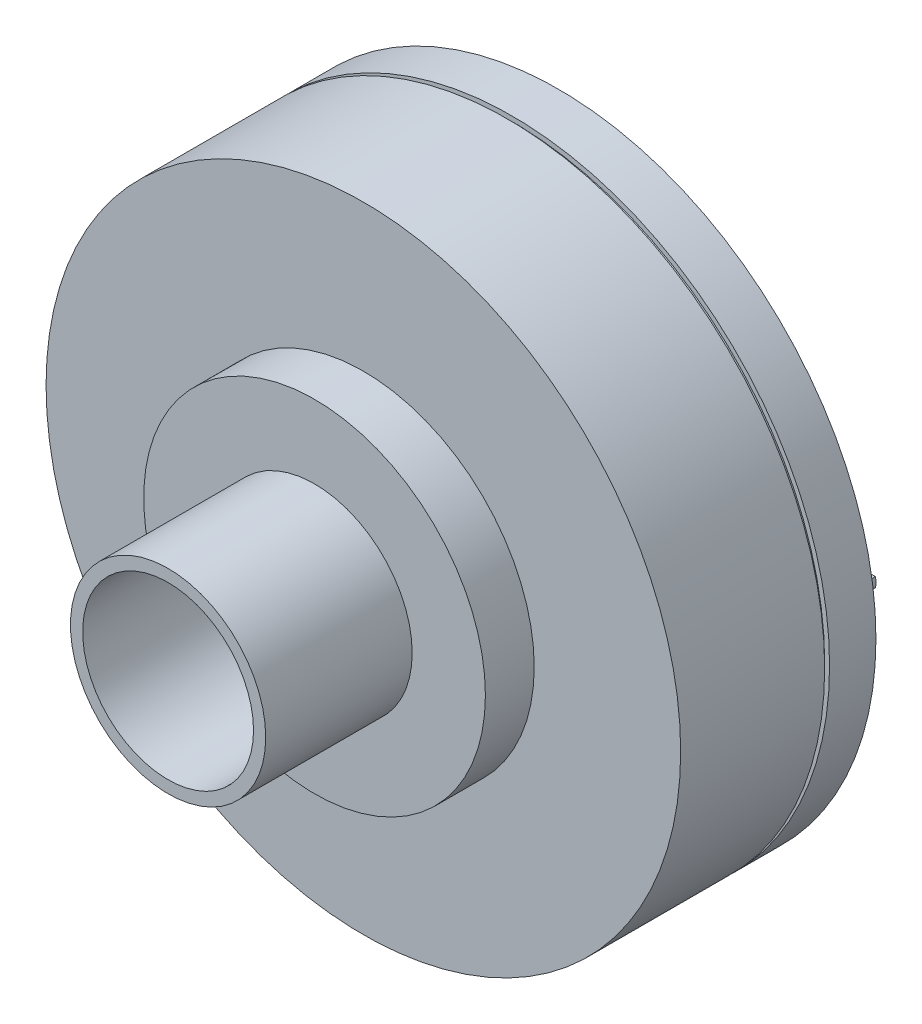
ISO-10303-21;
HEADER;
FILE_DESCRIPTION(('STEP AP214'),'2;1');
FILE_NAME('part.step','',(''),(''),'','','');
FILE_SCHEMA(('AUTOMOTIVE_DESIGN { 1 0 10303 214 1 1 1 1 }'));
ENDSEC;
DATA;
#1=APPLICATION_CONTEXT('core data for automotive mechanical design processes');
#2=APPLICATION_PROTOCOL_DEFINITION('international standard','automotive_design',2000,#1);
#3=PRODUCT_CONTEXT('',#1,'mechanical');
#4=PRODUCT('Part','Part','',(#3));
#5=PRODUCT_RELATED_PRODUCT_CATEGORY('part','',(#4));
#6=PRODUCT_DEFINITION_FORMATION('','',#4);
#7=PRODUCT_DEFINITION_CONTEXT('part definition',#1,'design');
#8=PRODUCT_DEFINITION('design','',#6,#7);
#9=PRODUCT_DEFINITION_SHAPE('','',#8);
#10=(LENGTH_UNIT() NAMED_UNIT(*) SI_UNIT(.MILLI.,.METRE.));
#11=(NAMED_UNIT(*) PLANE_ANGLE_UNIT() SI_UNIT($,.RADIAN.));
#12=(NAMED_UNIT(*) SI_UNIT($,.STERADIAN.) SOLID_ANGLE_UNIT());
#13=UNCERTAINTY_MEASURE_WITH_UNIT(LENGTH_MEASURE(1.E-05),#10,'distance_accuracy_value','');
#14=(GEOMETRIC_REPRESENTATION_CONTEXT(3) GLOBAL_UNCERTAINTY_ASSIGNED_CONTEXT((#13)) GLOBAL_UNIT_ASSIGNED_CONTEXT((#10,
#11,#12)) REPRESENTATION_CONTEXT('',''));
#15=CARTESIAN_POINT('',(0.,0.,0.));
#16=DIRECTION('',(0.,0.,1.));
#17=DIRECTION('',(1.,0.,0.));
#18=AXIS2_PLACEMENT_3D('',#15,#16,#17);
#19=CARTESIAN_POINT('',(2.,-3.,1.));
#20=DIRECTION('',(0.,0.,-1.));
#21=DIRECTION('',(-1.,0.,0.));
#22=AXIS2_PLACEMENT_3D('',#19,#20,#21);
#23=CYLINDRICAL_SURFACE('',#22,0.5);
#24=DIRECTION('',(0.,0.,1.));
#25=VECTOR('',#24,1.);
#26=CARTESIAN_POINT('',(1.51010205144336,-2.9,-4.));
#27=LINE('',#26,#25);
#28=CARTESIAN_POINT('',(1.51010205144336,-2.9,0.));
#29=VERTEX_POINT('',#28);
#30=CARTESIAN_POINT('',(1.51010205144336,-2.9,1.));
#31=VERTEX_POINT('',#30);
#32=EDGE_CURVE('E185',#29,#31,#27,.T.);
#33=ORIENTED_EDGE('',*,*,#32,.F.);
#34=CARTESIAN_POINT('',(2.,-3.,0.));
#35=DIRECTION('',(0.,0.,-1.));
#36=DIRECTION('',(-1.,0.,0.));
#37=AXIS2_PLACEMENT_3D('',#34,#35,#36);
#38=CIRCLE('',#37,0.5);
#39=CARTESIAN_POINT('',(2.48989794855664,-2.9,0.));
#40=VERTEX_POINT('',#39);
#41=EDGE_CURVE('E278',#29,#40,#38,.T.);
#42=ORIENTED_EDGE('',*,*,#41,.T.);
#43=DIRECTION('',(0.,0.,1.));
#44=VECTOR('',#43,1.);
#45=CARTESIAN_POINT('',(2.48989794855664,-2.9,-4.));
#46=LINE('',#45,#44);
#47=CARTESIAN_POINT('',(2.48989794855664,-2.9,1.));
#48=VERTEX_POINT('',#47);
#49=EDGE_CURVE('E747',#40,#48,#46,.T.);
#50=ORIENTED_EDGE('',*,*,#49,.T.);
#51=CARTESIAN_POINT('',(2.,-3.,1.));
#52=DIRECTION('',(0.,0.,-1.));
#53=DIRECTION('',(-1.,0.,0.));
#54=AXIS2_PLACEMENT_3D('',#51,#52,#53);
#55=CIRCLE('',#54,0.5);
#56=EDGE_CURVE('E273',#31,#48,#55,.T.);
#57=ORIENTED_EDGE('',*,*,#56,.F.);
#58=EDGE_LOOP('',(#33,#42,#50,#57));
#59=FACE_BOUND('',#58,.T.);
#60=ADVANCED_FACE('F32',(#59),#23,.F.);
#61=DIRECTION('',(0.,0.,1.));
#62=VECTOR('',#61,1.);
#63=CARTESIAN_POINT('',(2.48989794855664,-3.1,-4.));
#64=LINE('',#63,#62);
#65=CARTESIAN_POINT('',(2.48989794855664,-3.1,0.));
#66=VERTEX_POINT('',#65);
#67=CARTESIAN_POINT('',(2.48989794855664,-3.1,1.));
#68=VERTEX_POINT('',#67);
#69=EDGE_CURVE('E47',#66,#68,#64,.T.);
#70=ORIENTED_EDGE('',*,*,#69,.F.);
#71=CARTESIAN_POINT('',(1.51010205144336,-3.1,0.));
#72=VERTEX_POINT('',#71);
#73=EDGE_CURVE('E268',#66,#72,#38,.T.);
#74=ORIENTED_EDGE('',*,*,#73,.T.);
#75=DIRECTION('',(0.,0.,1.));
#76=VECTOR('',#75,1.);
#77=CARTESIAN_POINT('',(1.51010205144336,-3.1,-4.));
#78=LINE('',#77,#76);
#79=CARTESIAN_POINT('',(1.51010205144336,-3.1,1.));
#80=VERTEX_POINT('',#79);
#81=EDGE_CURVE('E756',#72,#80,#78,.T.);
#82=ORIENTED_EDGE('',*,*,#81,.T.);
#83=EDGE_CURVE('E277',#68,#80,#55,.T.);
#84=ORIENTED_EDGE('',*,*,#83,.F.);
#85=EDGE_LOOP('',(#70,#74,#82,#84));
#86=FACE_BOUND('',#85,.T.);
#87=ADVANCED_FACE('F331',(#86),#23,.F.);
#88=CARTESIAN_POINT('',(2.,-3.,1.));
#89=DIRECTION('',(0.,0.,-1.));
#90=DIRECTION('',(-1.,0.,0.));
#91=AXIS2_PLACEMENT_3D('',#88,#89,#90);
#92=PLANE('',#91);
#93=ORIENTED_EDGE('',*,*,#56,.T.);
#94=DIRECTION('',(1.,0.,0.));
#95=VECTOR('',#94,1.);
#96=CARTESIAN_POINT('',(2.48989794855664,-2.9,1.));
#97=LINE('',#96,#95);
#98=EDGE_CURVE('E749',#31,#48,#97,.T.);
#99=ORIENTED_EDGE('',*,*,#98,.F.);
#100=EDGE_LOOP('',(#93,#99));
#101=FACE_BOUND('',#100,.T.);
#102=ADVANCED_FACE('F337',(#101),#92,.T.);
#103=ORIENTED_EDGE('',*,*,#83,.T.);
#104=DIRECTION('',(-1.,0.,0.));
#105=VECTOR('',#104,1.);
#106=CARTESIAN_POINT('',(2.48989794855664,-3.1,1.));
#107=LINE('',#106,#105);
#108=EDGE_CURVE('E179',#68,#80,#107,.T.);
#109=ORIENTED_EDGE('',*,*,#108,.F.);
#110=EDGE_LOOP('',(#103,#109));
#111=FACE_BOUND('',#110,.T.);
#112=ADVANCED_FACE('F589',(#111),#92,.T.);
#113=CARTESIAN_POINT('',(-2.,-3.,1.));
#114=DIRECTION('',(0.,0.,-1.));
#115=DIRECTION('',(-1.,0.,0.));
#116=AXIS2_PLACEMENT_3D('',#113,#114,#115);
#117=CYLINDRICAL_SURFACE('',#116,0.5);
#118=DIRECTION('',(0.,0.,1.));
#119=VECTOR('',#118,1.);
#120=CARTESIAN_POINT('',(-2.48989794855664,-2.9,-4.));
#121=LINE('',#120,#119);
#122=CARTESIAN_POINT('',(-2.48989794855664,-2.9,0.));
#123=VERTEX_POINT('',#122);
#124=CARTESIAN_POINT('',(-2.48989794855664,-2.9,1.));
#125=VERTEX_POINT('',#124);
#126=EDGE_CURVE('E215',#123,#125,#121,.T.);
#127=ORIENTED_EDGE('',*,*,#126,.F.);
#128=CARTESIAN_POINT('',(-2.,-3.,0.));
#129=DIRECTION('',(0.,0.,-1.));
#130=DIRECTION('',(-1.,0.,0.));
#131=AXIS2_PLACEMENT_3D('',#128,#129,#130);
#132=CIRCLE('',#131,0.5);
#133=CARTESIAN_POINT('',(-1.51010205144336,-2.9,0.));
#134=VERTEX_POINT('',#133);
#135=EDGE_CURVE('E270',#123,#134,#132,.T.);
#136=ORIENTED_EDGE('',*,*,#135,.T.);
#137=DIRECTION('',(0.,0.,1.));
#138=VECTOR('',#137,1.);
#139=CARTESIAN_POINT('',(-1.51010205144336,-2.9,-4.));
#140=LINE('',#139,#138);
#141=CARTESIAN_POINT('',(-1.51010205144336,-2.9,1.));
#142=VERTEX_POINT('',#141);
#143=EDGE_CURVE('E211',#134,#142,#140,.T.);
#144=ORIENTED_EDGE('',*,*,#143,.T.);
#145=CARTESIAN_POINT('',(-2.,-3.,1.));
#146=DIRECTION('',(0.,0.,-1.));
#147=DIRECTION('',(-1.,0.,0.));
#148=AXIS2_PLACEMENT_3D('',#145,#146,#147);
#149=CIRCLE('',#148,0.5);
#150=EDGE_CURVE('E265',#125,#142,#149,.T.);
#151=ORIENTED_EDGE('',*,*,#150,.F.);
#152=EDGE_LOOP('',(#127,#136,#144,#151));
#153=FACE_BOUND('',#152,.T.);
#154=ADVANCED_FACE('F597',(#153),#117,.F.);
#155=DIRECTION('',(0.,0.,1.));
#156=VECTOR('',#155,1.);
#157=CARTESIAN_POINT('',(-1.51010205144336,-3.1,-4.));
#158=LINE('',#157,#156);
#159=CARTESIAN_POINT('',(-1.51010205144336,-3.1,0.));
#160=VERTEX_POINT('',#159);
#161=CARTESIAN_POINT('',(-1.51010205144336,-3.1,1.));
#162=VERTEX_POINT('',#161);
#163=EDGE_CURVE('E55',#160,#162,#158,.T.);
#164=ORIENTED_EDGE('',*,*,#163,.F.);
#165=CARTESIAN_POINT('',(-2.48989794855664,-3.1,0.));
#166=VERTEX_POINT('',#165);
#167=EDGE_CURVE('E260',#160,#166,#132,.T.);
#168=ORIENTED_EDGE('',*,*,#167,.T.);
#169=DIRECTION('',(0.,0.,1.));
#170=VECTOR('',#169,1.);
#171=CARTESIAN_POINT('',(-2.48989794855664,-3.1,-4.));
#172=LINE('',#171,#170);
#173=CARTESIAN_POINT('',(-2.48989794855664,-3.1,1.));
#174=VERTEX_POINT('',#173);
#175=EDGE_CURVE('E203',#166,#174,#172,.T.);
#176=ORIENTED_EDGE('',*,*,#175,.T.);
#177=EDGE_CURVE('E269',#162,#174,#149,.T.);
#178=ORIENTED_EDGE('',*,*,#177,.F.);
#179=EDGE_LOOP('',(#164,#168,#176,#178));
#180=FACE_BOUND('',#179,.T.);
#181=ADVANCED_FACE('F605',(#180),#117,.F.);
#182=CARTESIAN_POINT('',(-2.,-3.,1.));
#183=DIRECTION('',(0.,0.,-1.));
#184=DIRECTION('',(-1.,0.,0.));
#185=AXIS2_PLACEMENT_3D('',#182,#183,#184);
#186=PLANE('',#185);
#187=ORIENTED_EDGE('',*,*,#150,.T.);
#188=DIRECTION('',(1.,0.,0.));
#189=VECTOR('',#188,1.);
#190=CARTESIAN_POINT('',(-1.51010205144336,-2.9,1.));
#191=LINE('',#190,#189);
#192=EDGE_CURVE('E192',#125,#142,#191,.T.);
#193=ORIENTED_EDGE('',*,*,#192,.F.);
#194=EDGE_LOOP('',(#187,#193));
#195=FACE_BOUND('',#194,.T.);
#196=ADVANCED_FACE('F613',(#195),#186,.T.);
#197=ORIENTED_EDGE('',*,*,#177,.T.);
#198=DIRECTION('',(-1.,0.,0.));
#199=VECTOR('',#198,1.);
#200=CARTESIAN_POINT('',(-1.51010205144336,-3.1,1.));
#201=LINE('',#200,#199);
#202=EDGE_CURVE('E197',#162,#174,#201,.T.);
#203=ORIENTED_EDGE('',*,*,#202,.F.);
#204=EDGE_LOOP('',(#197,#203));
#205=FACE_BOUND('',#204,.T.);
#206=ADVANCED_FACE('F621',(#205),#186,.T.);
#207=CARTESIAN_POINT('',(0.,-2.,1.));
#208=DIRECTION('',(0.,0.,-1.));
#209=DIRECTION('',(-1.,0.,0.));
#210=AXIS2_PLACEMENT_3D('',#207,#208,#209);
#211=CYLINDRICAL_SURFACE('',#210,0.5);
#212=DIRECTION('',(0.,0.,1.));
#213=VECTOR('',#212,1.);
#214=CARTESIAN_POINT('',(-0.489897948556636,-1.9,-4.));
#215=LINE('',#214,#213);
#216=CARTESIAN_POINT('',(-0.489897948556636,-1.9,0.));
#217=VERTEX_POINT('',#216);
#218=CARTESIAN_POINT('',(-0.489897948556636,-1.9,1.));
#219=VERTEX_POINT('',#218);
#220=EDGE_CURVE('E248',#217,#219,#215,.T.);
#221=ORIENTED_EDGE('',*,*,#220,.F.);
#222=CARTESIAN_POINT('',(0.,-2.,0.));
#223=DIRECTION('',(0.,0.,-1.));
#224=DIRECTION('',(-1.,0.,0.));
#225=AXIS2_PLACEMENT_3D('',#222,#223,#224);
#226=CIRCLE('',#225,0.5);
#227=CARTESIAN_POINT('',(0.489897948556636,-1.9,0.));
#228=VERTEX_POINT('',#227);
#229=EDGE_CURVE('E262',#217,#228,#226,.T.);
#230=ORIENTED_EDGE('',*,*,#229,.T.);
#231=DIRECTION('',(0.,0.,1.));
#232=VECTOR('',#231,1.);
#233=CARTESIAN_POINT('',(0.489897948556636,-1.9,-4.));
#234=LINE('',#233,#232);
#235=CARTESIAN_POINT('',(0.489897948556636,-1.9,1.));
#236=VERTEX_POINT('',#235);
#237=EDGE_CURVE('E244',#228,#236,#234,.T.);
#238=ORIENTED_EDGE('',*,*,#237,.T.);
#239=CARTESIAN_POINT('',(0.,-2.,1.));
#240=DIRECTION('',(0.,0.,-1.));
#241=DIRECTION('',(-1.,0.,0.));
#242=AXIS2_PLACEMENT_3D('',#239,#240,#241);
#243=CIRCLE('',#242,0.5);
#244=EDGE_CURVE('E257',#219,#236,#243,.T.);
#245=ORIENTED_EDGE('',*,*,#244,.F.);
#246=EDGE_LOOP('',(#221,#230,#238,#245));
#247=FACE_BOUND('',#246,.T.);
#248=ADVANCED_FACE('F630',(#247),#211,.F.);
#249=DIRECTION('',(0.,0.,1.));
#250=VECTOR('',#249,1.);
#251=CARTESIAN_POINT('',(0.489897948556636,-2.1,-4.));
#252=LINE('',#251,#250);
#253=CARTESIAN_POINT('',(0.489897948556636,-2.1,0.));
#254=VERTEX_POINT('',#253);
#255=CARTESIAN_POINT('',(0.489897948556636,-2.1,1.));
#256=VERTEX_POINT('',#255);
#257=EDGE_CURVE('E240',#254,#256,#252,.T.);
#258=ORIENTED_EDGE('',*,*,#257,.F.);
#259=CARTESIAN_POINT('',(-0.489897948556636,-2.1,0.));
#260=VERTEX_POINT('',#259);
#261=EDGE_CURVE('E256',#254,#260,#226,.T.);
#262=ORIENTED_EDGE('',*,*,#261,.T.);
#263=DIRECTION('',(0.,0.,1.));
#264=VECTOR('',#263,1.);
#265=CARTESIAN_POINT('',(-0.489897948556636,-2.1,-4.));
#266=LINE('',#265,#264);
#267=CARTESIAN_POINT('',(-0.489897948556636,-2.1,1.));
#268=VERTEX_POINT('',#267);
#269=EDGE_CURVE('E234',#260,#268,#266,.T.);
#270=ORIENTED_EDGE('',*,*,#269,.T.);
#271=EDGE_CURVE('E261',#256,#268,#243,.T.);
#272=ORIENTED_EDGE('',*,*,#271,.F.);
#273=EDGE_LOOP('',(#258,#262,#270,#272));
#274=FACE_BOUND('',#273,.T.);
#275=ADVANCED_FACE('F638',(#274),#211,.F.);
#276=CARTESIAN_POINT('',(0.,-2.,1.));
#277=DIRECTION('',(0.,0.,-1.));
#278=DIRECTION('',(-1.,0.,0.));
#279=AXIS2_PLACEMENT_3D('',#276,#277,#278);
#280=PLANE('',#279);
#281=ORIENTED_EDGE('',*,*,#244,.T.);
#282=DIRECTION('',(1.,0.,0.));
#283=VECTOR('',#282,1.);
#284=CARTESIAN_POINT('',(0.489897948556636,-1.9,1.));
#285=LINE('',#284,#283);
#286=EDGE_CURVE('E223',#219,#236,#285,.T.);
#287=ORIENTED_EDGE('',*,*,#286,.F.);
#288=EDGE_LOOP('',(#281,#287));
#289=FACE_BOUND('',#288,.T.);
#290=ADVANCED_FACE('F325',(#289),#280,.T.);
#291=ORIENTED_EDGE('',*,*,#271,.T.);
#292=DIRECTION('',(-1.,0.,0.));
#293=VECTOR('',#292,1.);
#294=CARTESIAN_POINT('',(0.489897948556636,-2.1,1.));
#295=LINE('',#294,#293);
#296=EDGE_CURVE('E228',#256,#268,#295,.T.);
#297=ORIENTED_EDGE('',*,*,#296,.F.);
#298=EDGE_LOOP('',(#291,#297));
#299=FACE_BOUND('',#298,.T.);
#300=ADVANCED_FACE('F320',(#299),#280,.T.);
#301=CARTESIAN_POINT('',(0.,0.,0.));
#302=DIRECTION('',(0.,0.,1.));
#303=DIRECTION('',(1.,0.,0.));
#304=AXIS2_PLACEMENT_3D('',#301,#302,#303);
#305=PLANE('',#304);
#306=ORIENTED_EDGE('',*,*,#229,.F.);
#307=CARTESIAN_POINT('',(0.,-2.,0.));
#308=DIRECTION('',(0.,0.,1.));
#309=DIRECTION('',(1.,0.,0.));
#310=AXIS2_PLACEMENT_3D('',#307,#308,#309);
#311=CIRCLE('',#310,0.5);
#312=EDGE_CURVE('E254',#260,#217,#311,.F.);
#313=ORIENTED_EDGE('',*,*,#312,.F.);
#314=ORIENTED_EDGE('',*,*,#261,.F.);
#315=CARTESIAN_POINT('',(0.,-2.,0.));
#316=DIRECTION('',(0.,0.,1.));
#317=DIRECTION('',(1.,0.,0.));
#318=AXIS2_PLACEMENT_3D('',#315,#316,#317);
#319=CIRCLE('',#318,0.5);
#320=EDGE_CURVE('E252',#228,#254,#319,.F.);
#321=ORIENTED_EDGE('',*,*,#320,.F.);
#322=EDGE_LOOP('',(#306,#313,#314,#321));
#323=FACE_BOUND('',#322,.T.);
#324=ORIENTED_EDGE('',*,*,#135,.F.);
#325=CARTESIAN_POINT('',(-2.,-3.,0.));
#326=DIRECTION('',(0.,0.,1.));
#327=DIRECTION('',(1.,0.,0.));
#328=AXIS2_PLACEMENT_3D('',#325,#326,#327);
#329=CIRCLE('',#328,0.5);
#330=EDGE_CURVE('E221',#166,#123,#329,.F.);
#331=ORIENTED_EDGE('',*,*,#330,.F.);
#332=ORIENTED_EDGE('',*,*,#167,.F.);
#333=CARTESIAN_POINT('',(-2.,-3.,0.));
#334=DIRECTION('',(0.,0.,1.));
#335=DIRECTION('',(1.,0.,0.));
#336=AXIS2_PLACEMENT_3D('',#333,#334,#335);
#337=CIRCLE('',#336,0.5);
#338=EDGE_CURVE('E219',#134,#160,#337,.F.);
#339=ORIENTED_EDGE('',*,*,#338,.F.);
#340=EDGE_LOOP('',(#324,#331,#332,#339));
#341=FACE_BOUND('',#340,.T.);
#342=ORIENTED_EDGE('',*,*,#41,.F.);
#343=CARTESIAN_POINT('',(2.,-3.,0.));
#344=DIRECTION('',(0.,0.,1.));
#345=DIRECTION('',(1.,0.,0.));
#346=AXIS2_PLACEMENT_3D('',#343,#344,#345);
#347=CIRCLE('',#346,0.5);
#348=EDGE_CURVE('E183',#72,#29,#347,.F.);
#349=ORIENTED_EDGE('',*,*,#348,.F.);
#350=ORIENTED_EDGE('',*,*,#73,.F.);
#351=CARTESIAN_POINT('',(2.,-3.,0.));
#352=DIRECTION('',(0.,0.,1.));
#353=DIRECTION('',(1.,0.,0.));
#354=AXIS2_PLACEMENT_3D('',#351,#352,#353);
#355=CIRCLE('',#354,0.5);
#356=EDGE_CURVE('E184',#40,#66,#355,.F.);
#357=ORIENTED_EDGE('',*,*,#356,.F.);
#358=EDGE_LOOP('',(#342,#349,#350,#357));
#359=FACE_BOUND('',#358,.T.);
#360=CARTESIAN_POINT('',(0.,0.,0.));
#361=DIRECTION('',(0.,0.,1.));
#362=DIRECTION('',(1.,0.,0.));
#363=AXIS2_PLACEMENT_3D('',#360,#361,#362);
#364=CIRCLE('',#363,6.5);
#365=CARTESIAN_POINT('',(6.5,0.,0.));
#366=VERTEX_POINT('',#365);
#367=EDGE_CURVE('E11',#366,#366,#364,.T.);
#368=ORIENTED_EDGE('',*,*,#367,.F.);
#369=EDGE_LOOP('',(#368));
#370=FACE_BOUND('',#369,.T.);
#371=ADVANCED_FACE('F34',(#323,#341,#359,#370),#305,.F.);
#372=CARTESIAN_POINT('',(0.,0.,4.));
#373=DIRECTION('',(0.,0.,1.));
#374=DIRECTION('',(1.,0.,0.));
#375=AXIS2_PLACEMENT_3D('',#372,#373,#374);
#376=CYLINDRICAL_SURFACE('',#375,6.5);
#377=CARTESIAN_POINT('',(0.,0.,0.95));
#378=DIRECTION('',(0.,0.,1.));
#379=DIRECTION('',(1.,0.,0.));
#380=AXIS2_PLACEMENT_3D('',#377,#378,#379);
#381=CIRCLE('',#380,6.5);
#382=CARTESIAN_POINT('',(6.5,0.,0.95));
#383=VERTEX_POINT('',#382);
#384=EDGE_CURVE('E40',#383,#383,#381,.T.);
#385=ORIENTED_EDGE('',*,*,#384,.F.);
#386=EDGE_LOOP('',(#385));
#387=FACE_BOUND('',#386,.T.);
#388=ORIENTED_EDGE('',*,*,#367,.T.);
#389=EDGE_LOOP('',(#388));
#390=FACE_BOUND('',#389,.T.);
#391=ADVANCED_FACE('F314',(#387,#390),#376,.T.);
#392=CARTESIAN_POINT('',(0.,6.5,0.95));
#393=DIRECTION('',(0.,0.,-1.));
#394=DIRECTION('',(-1.,0.,0.));
#395=AXIS2_PLACEMENT_3D('',#392,#393,#394);
#396=PLANE('',#395);
#397=CARTESIAN_POINT('',(0.,0.,0.95));
#398=DIRECTION('',(0.,0.,1.));
#399=DIRECTION('',(1.,0.,0.));
#400=AXIS2_PLACEMENT_3D('',#397,#398,#399);
#401=CIRCLE('',#400,6.4);
#402=CARTESIAN_POINT('',(6.4,0.,0.95));
#403=VERTEX_POINT('',#402);
#404=EDGE_CURVE('E307',#403,#403,#401,.T.);
#405=ORIENTED_EDGE('',*,*,#404,.F.);
#406=EDGE_LOOP('',(#405));
#407=FACE_BOUND('',#406,.T.);
#408=ORIENTED_EDGE('',*,*,#384,.T.);
#409=EDGE_LOOP('',(#408));
#410=FACE_BOUND('',#409,.T.);
#411=ADVANCED_FACE('F312',(#407,#410),#396,.F.);
#412=CARTESIAN_POINT('',(0.,0.,4.));
#413=DIRECTION('',(0.,0.,1.));
#414=DIRECTION('',(1.,0.,0.));
#415=AXIS2_PLACEMENT_3D('',#412,#413,#414);
#416=CYLINDRICAL_SURFACE('',#415,6.4);
#417=CARTESIAN_POINT('',(0.,0.,1.05));
#418=DIRECTION('',(0.,0.,1.));
#419=DIRECTION('',(1.,0.,0.));
#420=AXIS2_PLACEMENT_3D('',#417,#418,#419);
#421=CIRCLE('',#420,6.4);
#422=CARTESIAN_POINT('',(6.4,0.,1.05));
#423=VERTEX_POINT('',#422);
#424=EDGE_CURVE('E304',#423,#423,#421,.T.);
#425=ORIENTED_EDGE('',*,*,#424,.F.);
#426=EDGE_LOOP('',(#425));
#427=FACE_BOUND('',#426,.T.);
#428=ORIENTED_EDGE('',*,*,#404,.T.);
#429=EDGE_LOOP('',(#428));
#430=FACE_BOUND('',#429,.T.);
#431=ADVANCED_FACE('F378',(#427,#430),#416,.T.);
#432=CARTESIAN_POINT('',(0.,6.4,1.05));
#433=DIRECTION('',(0.,0.,1.));
#434=DIRECTION('',(1.,0.,0.));
#435=AXIS2_PLACEMENT_3D('',#432,#433,#434);
#436=PLANE('',#435);
#437=CARTESIAN_POINT('',(0.,0.,1.05));
#438=DIRECTION('',(0.,0.,1.));
#439=DIRECTION('',(1.,0.,0.));
#440=AXIS2_PLACEMENT_3D('',#437,#438,#439);
#441=CIRCLE('',#440,6.5);
#442=CARTESIAN_POINT('',(6.5,0.,1.05));
#443=VERTEX_POINT('',#442);
#444=EDGE_CURVE('E301',#443,#443,#441,.T.);
#445=ORIENTED_EDGE('',*,*,#444,.F.);
#446=EDGE_LOOP('',(#445));
#447=FACE_BOUND('',#446,.T.);
#448=ORIENTED_EDGE('',*,*,#424,.T.);
#449=EDGE_LOOP('',(#448));
#450=FACE_BOUND('',#449,.T.);
#451=ADVANCED_FACE('F374',(#447,#450),#436,.F.);
#452=CARTESIAN_POINT('',(0.,0.,4.));
#453=DIRECTION('',(0.,0.,1.));
#454=DIRECTION('',(1.,0.,0.));
#455=AXIS2_PLACEMENT_3D('',#452,#453,#454);
#456=CYLINDRICAL_SURFACE('',#455,6.5);
#457=CARTESIAN_POINT('',(0.,0.,4.));
#458=DIRECTION('',(0.,0.,1.));
#459=DIRECTION('',(1.,0.,0.));
#460=AXIS2_PLACEMENT_3D('',#457,#458,#459);
#461=CIRCLE('',#460,6.5);
#462=CARTESIAN_POINT('',(6.5,0.,4.));
#463=VERTEX_POINT('',#462);
#464=EDGE_CURVE('E298',#463,#463,#461,.T.);
#465=ORIENTED_EDGE('',*,*,#464,.F.);
#466=EDGE_LOOP('',(#465));
#467=FACE_BOUND('',#466,.T.);
#468=ORIENTED_EDGE('',*,*,#444,.T.);
#469=EDGE_LOOP('',(#468));
#470=FACE_BOUND('',#469,.T.);
#471=ADVANCED_FACE('F370',(#467,#470),#456,.T.);
#472=CARTESIAN_POINT('',(0.,6.5,4.));
#473=DIRECTION('',(0.,0.,-1.));
#474=DIRECTION('',(-1.,0.,0.));
#475=AXIS2_PLACEMENT_3D('',#472,#473,#474);
#476=PLANE('',#475);
#477=CARTESIAN_POINT('',(0.,0.,4.));
#478=DIRECTION('',(0.,0.,1.));
#479=DIRECTION('',(1.,0.,0.));
#480=AXIS2_PLACEMENT_3D('',#477,#478,#479);
#481=CIRCLE('',#480,3.5);
#482=CARTESIAN_POINT('',(3.5,0.,4.));
#483=VERTEX_POINT('',#482);
#484=EDGE_CURVE('E295',#483,#483,#481,.T.);
#485=ORIENTED_EDGE('',*,*,#484,.F.);
#486=EDGE_LOOP('',(#485));
#487=FACE_BOUND('',#486,.T.);
#488=ORIENTED_EDGE('',*,*,#464,.T.);
#489=EDGE_LOOP('',(#488));
#490=FACE_BOUND('',#489,.T.);
#491=ADVANCED_FACE('F366',(#487,#490),#476,.F.);
#492=CARTESIAN_POINT('',(0.,0.,4.));
#493=DIRECTION('',(0.,0.,1.));
#494=DIRECTION('',(1.,0.,0.));
#495=AXIS2_PLACEMENT_3D('',#492,#493,#494);
#496=CYLINDRICAL_SURFACE('',#495,3.5);
#497=CARTESIAN_POINT('',(0.,0.,5.));
#498=DIRECTION('',(0.,0.,1.));
#499=DIRECTION('',(1.,0.,0.));
#500=AXIS2_PLACEMENT_3D('',#497,#498,#499);
#501=CIRCLE('',#500,3.5);
#502=CARTESIAN_POINT('',(3.5,0.,5.));
#503=VERTEX_POINT('',#502);
#504=EDGE_CURVE('E292',#503,#503,#501,.T.);
#505=ORIENTED_EDGE('',*,*,#504,.F.);
#506=EDGE_LOOP('',(#505));
#507=FACE_BOUND('',#506,.T.);
#508=ORIENTED_EDGE('',*,*,#484,.T.);
#509=EDGE_LOOP('',(#508));
#510=FACE_BOUND('',#509,.T.);
#511=ADVANCED_FACE('F362',(#507,#510),#496,.T.);
#512=CARTESIAN_POINT('',(0.,3.5,5.));
#513=DIRECTION('',(0.,0.,-1.));
#514=DIRECTION('',(-1.,0.,0.));
#515=AXIS2_PLACEMENT_3D('',#512,#513,#514);
#516=PLANE('',#515);
#517=CARTESIAN_POINT('',(0.,0.,5.));
#518=DIRECTION('',(0.,0.,1.));
#519=DIRECTION('',(1.,0.,0.));
#520=AXIS2_PLACEMENT_3D('',#517,#518,#519);
#521=CIRCLE('',#520,2.);
#522=CARTESIAN_POINT('',(2.,0.,5.));
#523=VERTEX_POINT('',#522);
#524=EDGE_CURVE('E289',#523,#523,#521,.T.);
#525=ORIENTED_EDGE('',*,*,#524,.F.);
#526=EDGE_LOOP('',(#525));
#527=FACE_BOUND('',#526,.T.);
#528=ORIENTED_EDGE('',*,*,#504,.T.);
#529=EDGE_LOOP('',(#528));
#530=FACE_BOUND('',#529,.T.);
#531=ADVANCED_FACE('F358',(#527,#530),#516,.F.);
#532=CARTESIAN_POINT('',(0.,0.,4.));
#533=DIRECTION('',(0.,0.,1.));
#534=DIRECTION('',(1.,0.,0.));
#535=AXIS2_PLACEMENT_3D('',#532,#533,#534);
#536=CYLINDRICAL_SURFACE('',#535,2.);
#537=CARTESIAN_POINT('',(0.,0.,8.));
#538=DIRECTION('',(0.,0.,1.));
#539=DIRECTION('',(1.,0.,0.));
#540=AXIS2_PLACEMENT_3D('',#537,#538,#539);
#541=CIRCLE('',#540,2.);
#542=CARTESIAN_POINT('',(2.,0.,8.));
#543=VERTEX_POINT('',#542);
#544=EDGE_CURVE('E286',#543,#543,#541,.T.);
#545=ORIENTED_EDGE('',*,*,#544,.F.);
#546=EDGE_LOOP('',(#545));
#547=FACE_BOUND('',#546,.T.);
#548=ORIENTED_EDGE('',*,*,#524,.T.);
#549=EDGE_LOOP('',(#548));
#550=FACE_BOUND('',#549,.T.);
#551=ADVANCED_FACE('F354',(#547,#550),#536,.T.);
#552=CARTESIAN_POINT('',(0.,2.,8.));
#553=DIRECTION('',(0.,0.,-1.));
#554=DIRECTION('',(-1.,0.,0.));
#555=AXIS2_PLACEMENT_3D('',#552,#553,#554);
#556=PLANE('',#555);
#557=CARTESIAN_POINT('',(0.,0.,8.));
#558=DIRECTION('',(0.,0.,1.));
#559=DIRECTION('',(1.,0.,0.));
#560=AXIS2_PLACEMENT_3D('',#557,#558,#559);
#561=CIRCLE('',#560,1.75);
#562=CARTESIAN_POINT('',(1.75,0.,8.));
#563=VERTEX_POINT('',#562);
#564=EDGE_CURVE('E283',#563,#563,#561,.T.);
#565=ORIENTED_EDGE('',*,*,#564,.F.);
#566=EDGE_LOOP('',(#565));
#567=FACE_BOUND('',#566,.T.);
#568=ORIENTED_EDGE('',*,*,#544,.T.);
#569=EDGE_LOOP('',(#568));
#570=FACE_BOUND('',#569,.T.);
#571=ADVANCED_FACE('F350',(#567,#570),#556,.F.);
#572=CARTESIAN_POINT('',(0.,0.,4.));
#573=DIRECTION('',(0.,0.,1.));
#574=DIRECTION('',(1.,0.,0.));
#575=AXIS2_PLACEMENT_3D('',#572,#573,#574);
#576=CYLINDRICAL_SURFACE('',#575,1.75);
#577=CARTESIAN_POINT('',(0.,0.,4.));
#578=DIRECTION('',(0.,0.,1.));
#579=DIRECTION('',(1.,0.,0.));
#580=AXIS2_PLACEMENT_3D('',#577,#578,#579);
#581=CIRCLE('',#580,1.75);
#582=CARTESIAN_POINT('',(1.75,0.,4.));
#583=VERTEX_POINT('',#582);
#584=EDGE_CURVE('E276',#583,#583,#581,.T.);
#585=ORIENTED_EDGE('',*,*,#584,.F.);
#586=EDGE_LOOP('',(#585));
#587=FACE_BOUND('',#586,.T.);
#588=ORIENTED_EDGE('',*,*,#564,.T.);
#589=EDGE_LOOP('',(#588));
#590=FACE_BOUND('',#589,.T.);
#591=ADVANCED_FACE('F346',(#587,#590),#576,.F.);
#592=CARTESIAN_POINT('',(0.,1.75,4.));
#593=DIRECTION('',(0.,0.,-1.));
#594=DIRECTION('',(-1.,0.,0.));
#595=AXIS2_PLACEMENT_3D('',#592,#593,#594);
#596=PLANE('',#595);
#597=ORIENTED_EDGE('',*,*,#584,.T.);
#598=EDGE_LOOP('',(#597));
#599=FACE_BOUND('',#598,.T.);
#600=ADVANCED_FACE('F342',(#599),#596,.F.);
#601=CARTESIAN_POINT('',(0.,-2.,-4.));
#602=DIRECTION('',(0.,0.,1.));
#603=DIRECTION('',(1.,0.,0.));
#604=AXIS2_PLACEMENT_3D('',#601,#602,#603);
#605=CYLINDRICAL_SURFACE('',#604,0.5);
#606=CARTESIAN_POINT('',(-0.489897948556636,-2.1,-4.));
#607=VERTEX_POINT('',#606);
#608=EDGE_CURVE('E237',#607,#260,#266,.T.);
#609=ORIENTED_EDGE('',*,*,#608,.T.);
#610=ORIENTED_EDGE('',*,*,#312,.T.);
#611=CARTESIAN_POINT('',(-0.489897948556636,-1.9,-4.));
#612=VERTEX_POINT('',#611);
#613=EDGE_CURVE('E249',#612,#217,#215,.T.);
#614=ORIENTED_EDGE('',*,*,#613,.F.);
#615=CARTESIAN_POINT('',(0.,-2.,-4.));
#616=DIRECTION('',(0.,0.,-1.));
#617=DIRECTION('',(-1.,0.,0.));
#618=AXIS2_PLACEMENT_3D('',#615,#616,#617);
#619=CIRCLE('',#618,0.5);
#620=EDGE_CURVE('E224',#607,#612,#619,.T.);
#621=ORIENTED_EDGE('',*,*,#620,.F.);
#622=EDGE_LOOP('',(#609,#610,#614,#621));
#623=FACE_BOUND('',#622,.T.);
#624=ADVANCED_FACE('F345',(#623),#605,.T.);
#625=CARTESIAN_POINT('',(0.,-2.,-4.));
#626=DIRECTION('',(0.,0.,1.));
#627=DIRECTION('',(1.,0.,0.));
#628=AXIS2_PLACEMENT_3D('',#625,#626,#627);
#629=CYLINDRICAL_SURFACE('',#628,0.5);
#630=CARTESIAN_POINT('',(0.489897948556636,-1.9,-4.));
#631=VERTEX_POINT('',#630);
#632=EDGE_CURVE('E245',#631,#228,#234,.T.);
#633=ORIENTED_EDGE('',*,*,#632,.T.);
#634=ORIENTED_EDGE('',*,*,#320,.T.);
#635=CARTESIAN_POINT('',(0.489897948556636,-2.1,-4.));
#636=VERTEX_POINT('',#635);
#637=EDGE_CURVE('E241',#636,#254,#252,.T.);
#638=ORIENTED_EDGE('',*,*,#637,.F.);
#639=CARTESIAN_POINT('',(0.,-2.,-4.));
#640=DIRECTION('',(0.,0.,-1.));
#641=DIRECTION('',(-1.,0.,0.));
#642=AXIS2_PLACEMENT_3D('',#639,#640,#641);
#643=CIRCLE('',#642,0.5);
#644=EDGE_CURVE('E230',#631,#636,#643,.T.);
#645=ORIENTED_EDGE('',*,*,#644,.F.);
#646=EDGE_LOOP('',(#633,#634,#638,#645));
#647=FACE_BOUND('',#646,.T.);
#648=ADVANCED_FACE('F437',(#647),#629,.T.);
#649=CARTESIAN_POINT('',(0.489897948556636,-1.9,-4.));
#650=DIRECTION('',(0.,-1.,0.));
#651=DIRECTION('',(0.,0.,-1.));
#652=AXIS2_PLACEMENT_3D('',#649,#650,#651);
#653=PLANE('',#652);
#654=ORIENTED_EDGE('',*,*,#286,.T.);
#655=ORIENTED_EDGE('',*,*,#237,.F.);
#656=ORIENTED_EDGE('',*,*,#632,.F.);
#657=DIRECTION('',(1.,0.,0.));
#658=VECTOR('',#657,1.);
#659=CARTESIAN_POINT('',(0.489897948556636,-1.9,-4.));
#660=LINE('',#659,#658);
#661=EDGE_CURVE('E227',#612,#631,#660,.T.);
#662=ORIENTED_EDGE('',*,*,#661,.F.);
#663=ORIENTED_EDGE('',*,*,#613,.T.);
#664=ORIENTED_EDGE('',*,*,#220,.T.);
#665=EDGE_LOOP('',(#654,#655,#656,#662,#663,#664));
#666=FACE_BOUND('',#665,.T.);
#667=ADVANCED_FACE('F445',(#666),#653,.F.);
#668=CARTESIAN_POINT('',(0.489897948556636,-2.1,-4.));
#669=DIRECTION('',(0.,1.,0.));
#670=DIRECTION('',(0.,0.,1.));
#671=AXIS2_PLACEMENT_3D('',#668,#669,#670);
#672=PLANE('',#671);
#673=ORIENTED_EDGE('',*,*,#296,.T.);
#674=ORIENTED_EDGE('',*,*,#269,.F.);
#675=ORIENTED_EDGE('',*,*,#608,.F.);
#676=DIRECTION('',(-1.,0.,0.));
#677=VECTOR('',#676,1.);
#678=CARTESIAN_POINT('',(0.489897948556636,-2.1,-4.));
#679=LINE('',#678,#677);
#680=EDGE_CURVE('E232',#636,#607,#679,.T.);
#681=ORIENTED_EDGE('',*,*,#680,.F.);
#682=ORIENTED_EDGE('',*,*,#637,.T.);
#683=ORIENTED_EDGE('',*,*,#257,.T.);
#684=EDGE_LOOP('',(#673,#674,#675,#681,#682,#683));
#685=FACE_BOUND('',#684,.T.);
#686=ADVANCED_FACE('F453',(#685),#672,.F.);
#687=CARTESIAN_POINT('',(0.,-2.,-4.));
#688=DIRECTION('',(0.,0.,-1.));
#689=DIRECTION('',(-1.,0.,0.));
#690=AXIS2_PLACEMENT_3D('',#687,#688,#689);
#691=PLANE('',#690);
#692=ORIENTED_EDGE('',*,*,#620,.T.);
#693=ORIENTED_EDGE('',*,*,#661,.T.);
#694=ORIENTED_EDGE('',*,*,#644,.T.);
#695=ORIENTED_EDGE('',*,*,#680,.T.);
#696=EDGE_LOOP('',(#692,#693,#694,#695));
#697=FACE_BOUND('',#696,.T.);
#698=ADVANCED_FACE('F461',(#697),#691,.T.);
#699=CARTESIAN_POINT('',(-2.,-3.,-4.));
#700=DIRECTION('',(0.,0.,1.));
#701=DIRECTION('',(1.,0.,0.));
#702=AXIS2_PLACEMENT_3D('',#699,#700,#701);
#703=CYLINDRICAL_SURFACE('',#702,0.5);
#704=CARTESIAN_POINT('',(-2.48989794855664,-3.1,-4.));
#705=VERTEX_POINT('',#704);
#706=EDGE_CURVE('E206',#705,#166,#172,.T.);
#707=ORIENTED_EDGE('',*,*,#706,.T.);
#708=ORIENTED_EDGE('',*,*,#330,.T.);
#709=CARTESIAN_POINT('',(-2.48989794855664,-2.9,-4.));
#710=VERTEX_POINT('',#709);
#711=EDGE_CURVE('E216',#710,#123,#121,.T.);
#712=ORIENTED_EDGE('',*,*,#711,.F.);
#713=CARTESIAN_POINT('',(-2.,-3.,-4.));
#714=DIRECTION('',(0.,0.,-1.));
#715=DIRECTION('',(-1.,0.,0.));
#716=AXIS2_PLACEMENT_3D('',#713,#714,#715);
#717=CIRCLE('',#716,0.5);
#718=EDGE_CURVE('E193',#705,#710,#717,.T.);
#719=ORIENTED_EDGE('',*,*,#718,.F.);
#720=EDGE_LOOP('',(#707,#708,#712,#719));
#721=FACE_BOUND('',#720,.T.);
#722=ADVANCED_FACE('F469',(#721),#703,.T.);
#723=CARTESIAN_POINT('',(-2.,-3.,-4.));
#724=DIRECTION('',(0.,0.,1.));
#725=DIRECTION('',(1.,0.,0.));
#726=AXIS2_PLACEMENT_3D('',#723,#724,#725);
#727=CYLINDRICAL_SURFACE('',#726,0.5);
#728=CARTESIAN_POINT('',(-1.51010205144336,-2.9,-4.));
#729=VERTEX_POINT('',#728);
#730=EDGE_CURVE('E212',#729,#134,#140,.T.);
#731=ORIENTED_EDGE('',*,*,#730,.T.);
#732=ORIENTED_EDGE('',*,*,#338,.T.);
#733=CARTESIAN_POINT('',(-1.51010205144336,-3.1,-4.));
#734=VERTEX_POINT('',#733);
#735=EDGE_CURVE('E209',#734,#160,#158,.T.);
#736=ORIENTED_EDGE('',*,*,#735,.F.);
#737=CARTESIAN_POINT('',(-2.,-3.,-4.));
#738=DIRECTION('',(0.,0.,-1.));
#739=DIRECTION('',(-1.,0.,0.));
#740=AXIS2_PLACEMENT_3D('',#737,#738,#739);
#741=CIRCLE('',#740,0.5);
#742=EDGE_CURVE('E199',#729,#734,#741,.T.);
#743=ORIENTED_EDGE('',*,*,#742,.F.);
#744=EDGE_LOOP('',(#731,#732,#736,#743));
#745=FACE_BOUND('',#744,.T.);
#746=ADVANCED_FACE('F477',(#745),#727,.T.);
#747=CARTESIAN_POINT('',(-1.51010205144336,-2.9,-4.));
#748=DIRECTION('',(0.,-1.,0.));
#749=DIRECTION('',(0.,0.,-1.));
#750=AXIS2_PLACEMENT_3D('',#747,#748,#749);
#751=PLANE('',#750);
#752=ORIENTED_EDGE('',*,*,#192,.T.);
#753=ORIENTED_EDGE('',*,*,#143,.F.);
#754=ORIENTED_EDGE('',*,*,#730,.F.);
#755=DIRECTION('',(1.,0.,0.));
#756=VECTOR('',#755,1.);
#757=CARTESIAN_POINT('',(-1.51010205144336,-2.9,-4.));
#758=LINE('',#757,#756);
#759=EDGE_CURVE('E196',#710,#729,#758,.T.);
#760=ORIENTED_EDGE('',*,*,#759,.F.);
#761=ORIENTED_EDGE('',*,*,#711,.T.);
#762=ORIENTED_EDGE('',*,*,#126,.T.);
#763=EDGE_LOOP('',(#752,#753,#754,#760,#761,#762));
#764=FACE_BOUND('',#763,.T.);
#765=ADVANCED_FACE('F485',(#764),#751,.F.);
#766=CARTESIAN_POINT('',(-1.51010205144336,-3.1,-4.));
#767=DIRECTION('',(0.,1.,0.));
#768=DIRECTION('',(0.,0.,1.));
#769=AXIS2_PLACEMENT_3D('',#766,#767,#768);
#770=PLANE('',#769);
#771=ORIENTED_EDGE('',*,*,#202,.T.);
#772=ORIENTED_EDGE('',*,*,#175,.F.);
#773=ORIENTED_EDGE('',*,*,#706,.F.);
#774=DIRECTION('',(-1.,0.,0.));
#775=VECTOR('',#774,1.);
#776=CARTESIAN_POINT('',(-1.51010205144336,-3.1,-4.));
#777=LINE('',#776,#775);
#778=EDGE_CURVE('E201',#734,#705,#777,.T.);
#779=ORIENTED_EDGE('',*,*,#778,.F.);
#780=ORIENTED_EDGE('',*,*,#735,.T.);
#781=ORIENTED_EDGE('',*,*,#163,.T.);
#782=EDGE_LOOP('',(#771,#772,#773,#779,#780,#781));
#783=FACE_BOUND('',#782,.T.);
#784=ADVANCED_FACE('F493',(#783),#770,.F.);
#785=CARTESIAN_POINT('',(-2.,-3.,-4.));
#786=DIRECTION('',(0.,0.,-1.));
#787=DIRECTION('',(-1.,0.,0.));
#788=AXIS2_PLACEMENT_3D('',#785,#786,#787);
#789=PLANE('',#788);
#790=ORIENTED_EDGE('',*,*,#718,.T.);
#791=ORIENTED_EDGE('',*,*,#759,.T.);
#792=ORIENTED_EDGE('',*,*,#742,.T.);
#793=ORIENTED_EDGE('',*,*,#778,.T.);
#794=EDGE_LOOP('',(#790,#791,#792,#793));
#795=FACE_BOUND('',#794,.T.);
#796=ADVANCED_FACE('F501',(#795),#789,.T.);
#797=CARTESIAN_POINT('',(2.,-3.,-4.));
#798=DIRECTION('',(0.,0.,1.));
#799=DIRECTION('',(1.,0.,0.));
#800=AXIS2_PLACEMENT_3D('',#797,#798,#799);
#801=CYLINDRICAL_SURFACE('',#800,0.5);
#802=CARTESIAN_POINT('',(1.51010205144336,-3.1,-4.));
#803=VERTEX_POINT('',#802);
#804=EDGE_CURVE('E755',#803,#72,#78,.T.);
#805=ORIENTED_EDGE('',*,*,#804,.T.);
#806=ORIENTED_EDGE('',*,*,#348,.T.);
#807=CARTESIAN_POINT('',(1.51010205144336,-2.9,-4.));
#808=VERTEX_POINT('',#807);
#809=EDGE_CURVE('E163',#808,#29,#27,.T.);
#810=ORIENTED_EDGE('',*,*,#809,.F.);
#811=CARTESIAN_POINT('',(2.,-3.,-4.));
#812=DIRECTION('',(0.,0.,-1.));
#813=DIRECTION('',(-1.,0.,0.));
#814=AXIS2_PLACEMENT_3D('',#811,#812,#813);
#815=CIRCLE('',#814,0.5);
#816=EDGE_CURVE('E170',#803,#808,#815,.T.);
#817=ORIENTED_EDGE('',*,*,#816,.F.);
#818=EDGE_LOOP('',(#805,#806,#810,#817));
#819=FACE_BOUND('',#818,.T.);
#820=ADVANCED_FACE('F181',(#819),#801,.T.);
#821=CARTESIAN_POINT('',(2.,-3.,-4.));
#822=DIRECTION('',(0.,0.,1.));
#823=DIRECTION('',(1.,0.,0.));
#824=AXIS2_PLACEMENT_3D('',#821,#822,#823);
#825=CYLINDRICAL_SURFACE('',#824,0.5);
#826=CARTESIAN_POINT('',(2.48989794855664,-2.9,-4.));
#827=VERTEX_POINT('',#826);
#828=EDGE_CURVE('E166',#827,#40,#46,.T.);
#829=ORIENTED_EDGE('',*,*,#828,.T.);
#830=ORIENTED_EDGE('',*,*,#356,.T.);
#831=CARTESIAN_POINT('',(2.48989794855664,-3.1,-4.));
#832=VERTEX_POINT('',#831);
#833=EDGE_CURVE('E757',#832,#66,#64,.T.);
#834=ORIENTED_EDGE('',*,*,#833,.F.);
#835=CARTESIAN_POINT('',(2.,-3.,-4.));
#836=DIRECTION('',(0.,0.,-1.));
#837=DIRECTION('',(-1.,0.,0.));
#838=AXIS2_PLACEMENT_3D('',#835,#836,#837);
#839=CIRCLE('',#838,0.5);
#840=EDGE_CURVE('E169',#827,#832,#839,.T.);
#841=ORIENTED_EDGE('',*,*,#840,.F.);
#842=EDGE_LOOP('',(#829,#830,#834,#841));
#843=FACE_BOUND('',#842,.T.);
#844=ADVANCED_FACE('F515',(#843),#825,.T.);
#845=CARTESIAN_POINT('',(2.48989794855664,-2.9,-4.));
#846=DIRECTION('',(0.,-1.,0.));
#847=DIRECTION('',(0.,0.,-1.));
#848=AXIS2_PLACEMENT_3D('',#845,#846,#847);
#849=PLANE('',#848);
#850=ORIENTED_EDGE('',*,*,#98,.T.);
#851=ORIENTED_EDGE('',*,*,#49,.F.);
#852=ORIENTED_EDGE('',*,*,#828,.F.);
#853=DIRECTION('',(1.,0.,0.));
#854=VECTOR('',#853,1.);
#855=CARTESIAN_POINT('',(2.48989794855664,-2.9,-4.));
#856=LINE('',#855,#854);
#857=EDGE_CURVE('E159',#808,#827,#856,.T.);
#858=ORIENTED_EDGE('',*,*,#857,.F.);
#859=ORIENTED_EDGE('',*,*,#809,.T.);
#860=ORIENTED_EDGE('',*,*,#32,.T.);
#861=EDGE_LOOP('',(#850,#851,#852,#858,#859,#860));
#862=FACE_BOUND('',#861,.T.);
#863=ADVANCED_FACE('F161',(#862),#849,.F.);
#864=CARTESIAN_POINT('',(2.48989794855664,-3.1,-4.));
#865=DIRECTION('',(0.,1.,0.));
#866=DIRECTION('',(0.,0.,1.));
#867=AXIS2_PLACEMENT_3D('',#864,#865,#866);
#868=PLANE('',#867);
#869=ORIENTED_EDGE('',*,*,#108,.T.);
#870=ORIENTED_EDGE('',*,*,#81,.F.);
#871=ORIENTED_EDGE('',*,*,#804,.F.);
#872=DIRECTION('',(-1.,0.,0.));
#873=VECTOR('',#872,1.);
#874=CARTESIAN_POINT('',(2.48989794855664,-3.1,-4.));
#875=LINE('',#874,#873);
#876=EDGE_CURVE('E175',#832,#803,#875,.T.);
#877=ORIENTED_EDGE('',*,*,#876,.F.);
#878=ORIENTED_EDGE('',*,*,#833,.T.);
#879=ORIENTED_EDGE('',*,*,#69,.T.);
#880=EDGE_LOOP('',(#869,#870,#871,#877,#878,#879));
#881=FACE_BOUND('',#880,.T.);
#882=ADVANCED_FACE('F529',(#881),#868,.F.);
#883=CARTESIAN_POINT('',(2.,-3.,-4.));
#884=DIRECTION('',(0.,0.,-1.));
#885=DIRECTION('',(-1.,0.,0.));
#886=AXIS2_PLACEMENT_3D('',#883,#884,#885);
#887=PLANE('',#886);
#888=ORIENTED_EDGE('',*,*,#816,.T.);
#889=ORIENTED_EDGE('',*,*,#857,.T.);
#890=ORIENTED_EDGE('',*,*,#840,.T.);
#891=ORIENTED_EDGE('',*,*,#876,.T.);
#892=EDGE_LOOP('',(#888,#889,#890,#891));
#893=FACE_BOUND('',#892,.T.);
#894=ADVANCED_FACE('F173',(#893),#887,.T.);
#895=CLOSED_SHELL('',(#60,#87,#102,#112,#154,#181,#196,#206,#248,#275,#290,#300,#371,#391,#411,
#431,#451,#471,#491,#511,#531,#551,#571,#591,#600,#624,#648,#667,#686,#698,#722,#746,#765,#784,
#796,#820,#844,#863,#882,#894));
#896=MANIFOLD_SOLID_BREP('B2',#895);
#897=ADVANCED_BREP_SHAPE_REPRESENTATION('',(#18,#896),#14);
#898=SHAPE_DEFINITION_REPRESENTATION(#9,#897);
ENDSEC;
END-ISO-10303-21;
